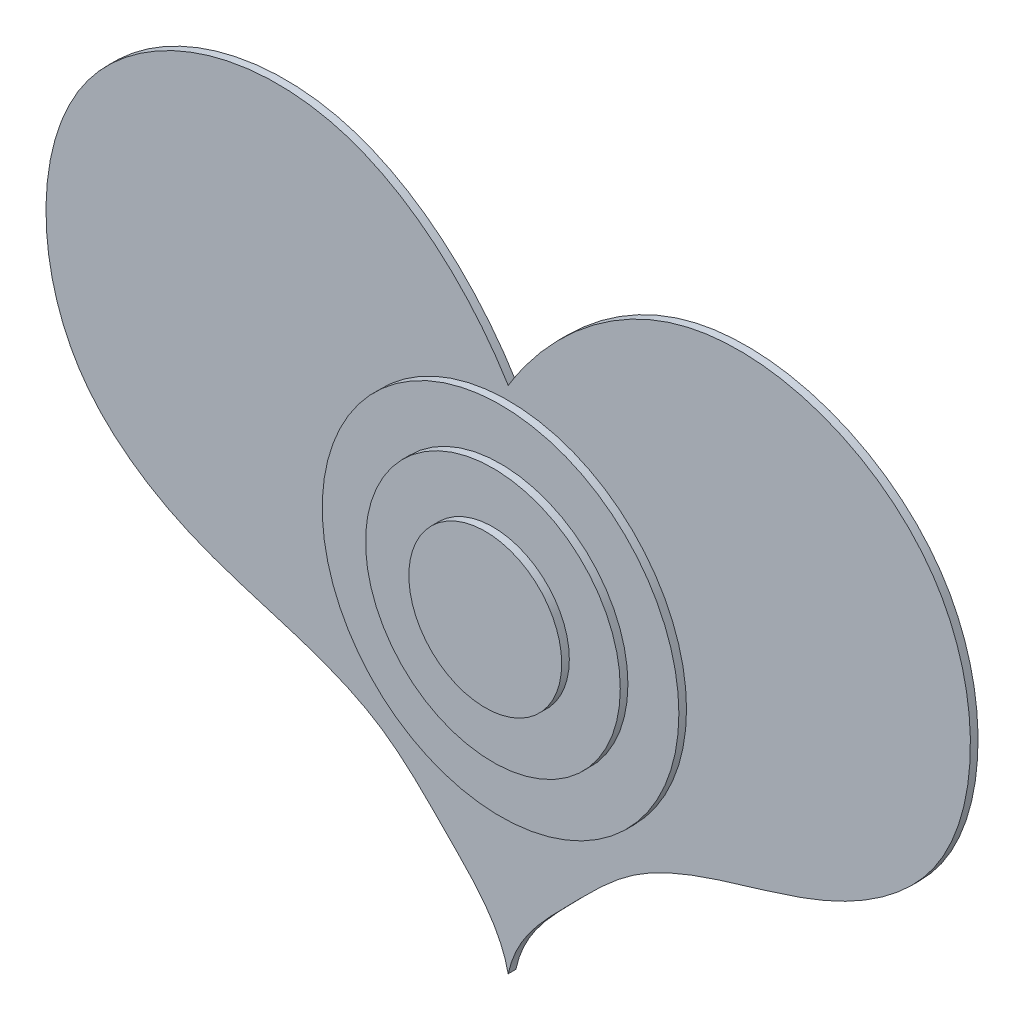
ISO-10303-21;
HEADER;
FILE_DESCRIPTION(('STEP AP214'),'2;1');
FILE_NAME('part.step','',(''),(''),'','','');
FILE_SCHEMA(('AUTOMOTIVE_DESIGN { 1 0 10303 214 1 1 1 1 }'));
ENDSEC;
DATA;
#1=APPLICATION_CONTEXT('core data for automotive mechanical design processes');
#2=APPLICATION_PROTOCOL_DEFINITION('international standard','automotive_design',2000,#1);
#3=PRODUCT_CONTEXT('',#1,'mechanical');
#4=PRODUCT('Part','Part','',(#3));
#5=PRODUCT_RELATED_PRODUCT_CATEGORY('part','',(#4));
#6=PRODUCT_DEFINITION_FORMATION('','',#4);
#7=PRODUCT_DEFINITION_CONTEXT('part definition',#1,'design');
#8=PRODUCT_DEFINITION('design','',#6,#7);
#9=PRODUCT_DEFINITION_SHAPE('','',#8);
#10=(LENGTH_UNIT() NAMED_UNIT(*) SI_UNIT(.MILLI.,.METRE.));
#11=(NAMED_UNIT(*) PLANE_ANGLE_UNIT() SI_UNIT($,.RADIAN.));
#12=(NAMED_UNIT(*) SI_UNIT($,.STERADIAN.) SOLID_ANGLE_UNIT());
#13=UNCERTAINTY_MEASURE_WITH_UNIT(LENGTH_MEASURE(1.E-05),#10,'distance_accuracy_value','');
#14=(GEOMETRIC_REPRESENTATION_CONTEXT(3) GLOBAL_UNCERTAINTY_ASSIGNED_CONTEXT((#13)) GLOBAL_UNIT_ASSIGNED_CONTEXT((#10,
#11,#12)) REPRESENTATION_CONTEXT('',''));
#15=CARTESIAN_POINT('',(0.,0.,0.));
#16=DIRECTION('',(0.,0.,1.));
#17=DIRECTION('',(1.,0.,0.));
#18=AXIS2_PLACEMENT_3D('',#15,#16,#17);
#19=CARTESIAN_POINT('',(0.,-105.813973502007,-3.));
#20=CARTESIAN_POINT('',(3.14138374352489,-91.1313982023127,-3.));
#21=CARTESIAN_POINT('',(21.9291711115177,-72.8831212609514,-3.));
#22=CARTESIAN_POINT('',(49.1347083795301,-44.2055416632962,-3.));
#23=CARTESIAN_POINT('',(86.9143629993046,-30.5957393724164,-3.));
#24=CARTESIAN_POINT('',(129.602182184017,-19.4679291518619,-3.));
#25=CARTESIAN_POINT('',(171.600514001264,9.5392138725982,-3.));
#26=CARTESIAN_POINT('',(186.12313576719,62.2376003688293,-3.));
#27=CARTESIAN_POINT('',(172.01966834021,117.463223926575,-3.));
#28=CARTESIAN_POINT('',(123.714536571012,151.359453215115,-3.));
#29=CARTESIAN_POINT('',(53.8376291321446,154.385235119023,-3.));
#30=CARTESIAN_POINT('',(14.9371970012457,118.791774845464,-3.));
#31=CARTESIAN_POINT('',(0.,94.1860264979931,-3.));
#32=B_SPLINE_CURVE_WITH_KNOTS('',3,(#19,#20,#21,#22,#23,#24,#25,#26,#27,#28,#29,#30,#31),
.UNSPECIFIED.,.F.,.F.,(4,1,1,1,1,1,1,1,1,1,4),(0.,0.0828178370463484,0.151533803954557,
0.22815870802058,0.311744756834966,0.411865787696182,0.507998966649175,0.612712913073144,
0.72508775508206,0.827311907634126,1.),.UNSPECIFIED.);
#33=DIRECTION('',(0.,0.,1.));
#34=VECTOR('',#33,1.);
#35=SURFACE_OF_LINEAR_EXTRUSION('',#32,#34);
#36=CARTESIAN_POINT('',(0.,-105.813973502007,0.));
#37=CARTESIAN_POINT('',(3.14138374352489,-91.1313982023127,0.));
#38=CARTESIAN_POINT('',(21.9291711115177,-72.8831212609514,0.));
#39=CARTESIAN_POINT('',(49.1347083795301,-44.2055416632962,0.));
#40=CARTESIAN_POINT('',(86.9143629993046,-30.5957393724164,0.));
#41=CARTESIAN_POINT('',(129.602182184017,-19.4679291518619,0.));
#42=CARTESIAN_POINT('',(171.600514001264,9.5392138725982,0.));
#43=CARTESIAN_POINT('',(186.12313576719,62.2376003688293,0.));
#44=CARTESIAN_POINT('',(172.01966834021,117.463223926575,0.));
#45=CARTESIAN_POINT('',(123.714536571012,151.359453215115,0.));
#46=CARTESIAN_POINT('',(53.8376291321446,154.385235119023,0.));
#47=CARTESIAN_POINT('',(14.9371970012457,118.791774845464,0.));
#48=CARTESIAN_POINT('',(0.,94.1860264979931,0.));
#49=B_SPLINE_CURVE_WITH_KNOTS('',3,(#36,#37,#38,#39,#40,#41,#42,#43,#44,#45,#46,#47,#48),
.UNSPECIFIED.,.F.,.F.,(4,1,1,1,1,1,1,1,1,1,4),(0.,0.0828178370463484,0.151533803954557,
0.22815870802058,0.311744756834966,0.411865787696182,0.507998966649175,0.612712913073144,
0.72508775508206,0.827311907634126,1.),.UNSPECIFIED.);
#50=CARTESIAN_POINT('',(0.,-105.813973502007,0.));
#51=VERTEX_POINT('',#50);
#52=CARTESIAN_POINT('',(0.,94.1860264979931,0.));
#53=VERTEX_POINT('',#52);
#54=EDGE_CURVE('E71',#51,#53,#49,.T.);
#55=ORIENTED_EDGE('',*,*,#54,.F.);
#56=DIRECTION('',(0.,0.,1.));
#57=VECTOR('',#56,1.);
#58=CARTESIAN_POINT('',(0.,-105.813973502007,-3.));
#59=LINE('',#58,#57);
#60=CARTESIAN_POINT('',(0.,-105.813973502007,-3.));
#61=VERTEX_POINT('',#60);
#62=EDGE_CURVE('E55',#61,#51,#59,.T.);
#63=ORIENTED_EDGE('',*,*,#62,.F.);
#64=CARTESIAN_POINT('',(0.,94.1860264979931,-3.));
#65=VERTEX_POINT('',#64);
#66=EDGE_CURVE('E76',#61,#65,#32,.T.);
#67=ORIENTED_EDGE('',*,*,#66,.T.);
#68=DIRECTION('',(0.,0.,1.));
#69=VECTOR('',#68,1.);
#70=CARTESIAN_POINT('',(0.,94.1860264979931,-3.));
#71=LINE('',#70,#69);
#72=EDGE_CURVE('E40',#65,#53,#71,.T.);
#73=ORIENTED_EDGE('',*,*,#72,.T.);
#74=EDGE_LOOP('',(#55,#63,#67,#73));
#75=FACE_BOUND('',#74,.T.);
#76=ADVANCED_FACE('F36',(#75),#35,.T.);
#77=CARTESIAN_POINT('',(0.,94.1860264979931,-3.));
#78=CARTESIAN_POINT('',(-14.9371970012457,118.791774845464,-3.));
#79=CARTESIAN_POINT('',(-53.8376291321446,154.385235119023,-3.));
#80=CARTESIAN_POINT('',(-123.714536571012,151.359453215115,-3.));
#81=CARTESIAN_POINT('',(-172.01966834021,117.463223926575,-3.));
#82=CARTESIAN_POINT('',(-186.123135767189,62.2376003688293,-3.));
#83=CARTESIAN_POINT('',(-171.600514001264,9.53921387259815,-3.));
#84=CARTESIAN_POINT('',(-129.602182184017,-19.467929151862,-3.));
#85=CARTESIAN_POINT('',(-86.9143629993045,-30.5957393724164,-3.));
#86=CARTESIAN_POINT('',(-49.1347083795301,-44.2055416632962,-3.));
#87=CARTESIAN_POINT('',(-21.9291711115176,-72.8831212609515,-3.));
#88=CARTESIAN_POINT('',(-3.14138374352487,-91.1313982023127,-3.));
#89=CARTESIAN_POINT('',(0.,-105.813973502007,-3.));
#90=B_SPLINE_CURVE_WITH_KNOTS('',3,(#77,#78,#79,#80,#81,#82,#83,#84,#85,#86,#87,#88,#89),
.UNSPECIFIED.,.F.,.F.,(4,1,1,1,1,1,1,1,1,1,4),(0.,0.172688092365874,0.27491224491794,
0.387287086926856,0.492001033350825,0.588134212303818,0.688255243165034,0.77184129197942,
0.848466196045443,0.917182162953652,1.),.UNSPECIFIED.);
#91=DIRECTION('',(0.,0.,1.));
#92=VECTOR('',#91,1.);
#93=SURFACE_OF_LINEAR_EXTRUSION('',#90,#92);
#94=CARTESIAN_POINT('',(0.,94.1860264979931,0.));
#95=CARTESIAN_POINT('',(-14.9371970012457,118.791774845464,0.));
#96=CARTESIAN_POINT('',(-53.8376291321446,154.385235119023,0.));
#97=CARTESIAN_POINT('',(-123.714536571012,151.359453215115,0.));
#98=CARTESIAN_POINT('',(-172.01966834021,117.463223926575,0.));
#99=CARTESIAN_POINT('',(-186.123135767189,62.2376003688293,0.));
#100=CARTESIAN_POINT('',(-171.600514001264,9.53921387259815,0.));
#101=CARTESIAN_POINT('',(-129.602182184017,-19.467929151862,0.));
#102=CARTESIAN_POINT('',(-86.9143629993045,-30.5957393724164,0.));
#103=CARTESIAN_POINT('',(-49.1347083795301,-44.2055416632962,0.));
#104=CARTESIAN_POINT('',(-21.9291711115176,-72.8831212609515,0.));
#105=CARTESIAN_POINT('',(-3.14138374352487,-91.1313982023127,0.));
#106=CARTESIAN_POINT('',(0.,-105.813973502007,0.));
#107=B_SPLINE_CURVE_WITH_KNOTS('',3,(#94,#95,#96,#97,#98,#99,#100,#101,#102,#103,#104,#105,
#106),.UNSPECIFIED.,.F.,.F.,(4,1,1,1,1,1,1,1,1,1,4),(0.,0.172688092365874,0.27491224491794,
0.387287086926856,0.492001033350825,0.588134212303818,0.688255243165034,0.77184129197942,
0.848466196045443,0.917182162953652,1.),.UNSPECIFIED.);
#108=EDGE_CURVE('E67',#53,#51,#107,.T.);
#109=ORIENTED_EDGE('',*,*,#108,.F.);
#110=ORIENTED_EDGE('',*,*,#72,.F.);
#111=EDGE_CURVE('E69',#65,#61,#90,.T.);
#112=ORIENTED_EDGE('',*,*,#111,.T.);
#113=ORIENTED_EDGE('',*,*,#62,.T.);
#114=EDGE_LOOP('',(#109,#110,#112,#113));
#115=FACE_BOUND('',#114,.T.);
#116=ADVANCED_FACE('F65',(#115),#93,.T.);
#117=CARTESIAN_POINT('',(181.241026456675,56.5785133089606,-3.));
#118=DIRECTION('',(0.,0.,1.));
#119=DIRECTION('',(1.,0.,0.));
#120=AXIS2_PLACEMENT_3D('',#117,#118,#119);
#121=PLANE('',#120);
#122=ORIENTED_EDGE('',*,*,#66,.F.);
#123=ORIENTED_EDGE('',*,*,#111,.F.);
#124=EDGE_LOOP('',(#122,#123));
#125=FACE_BOUND('',#124,.T.);
#126=ADVANCED_FACE('F101',(#125),#121,.F.);
#127=CARTESIAN_POINT('',(181.241026456675,56.5785133089606,0.));
#128=DIRECTION('',(0.,0.,1.));
#129=DIRECTION('',(1.,0.,0.));
#130=AXIS2_PLACEMENT_3D('',#127,#128,#129);
#131=PLANE('',#130);
#132=CARTESIAN_POINT('',(0.,19.1113090618028,0.));
#133=DIRECTION('',(0.,0.,1.));
#134=DIRECTION('',(1.,0.,0.));
#135=AXIS2_PLACEMENT_3D('',#132,#133,#134);
#136=CIRCLE('',#135,70.);
#137=CARTESIAN_POINT('',(70.,19.1113090618028,0.));
#138=VERTEX_POINT('',#137);
#139=EDGE_CURVE('E70',#138,#138,#136,.T.);
#140=ORIENTED_EDGE('',*,*,#139,.F.);
#141=EDGE_LOOP('',(#140));
#142=FACE_BOUND('',#141,.T.);
#143=ORIENTED_EDGE('',*,*,#54,.T.);
#144=ORIENTED_EDGE('',*,*,#108,.T.);
#145=EDGE_LOOP('',(#143,#144));
#146=FACE_BOUND('',#145,.T.);
#147=ADVANCED_FACE('F75',(#142,#146),#131,.T.);
#148=CARTESIAN_POINT('',(0.,19.1113090618028,3.));
#149=DIRECTION('',(0.,0.,-1.));
#150=DIRECTION('',(-1.,0.,0.));
#151=AXIS2_PLACEMENT_3D('',#148,#149,#150);
#152=CYLINDRICAL_SURFACE('',#151,70.);
#153=CARTESIAN_POINT('',(0.,19.1113090618028,3.));
#154=DIRECTION('',(0.,0.,1.));
#155=DIRECTION('',(1.,0.,0.));
#156=AXIS2_PLACEMENT_3D('',#153,#154,#155);
#157=CIRCLE('',#156,70.);
#158=CARTESIAN_POINT('',(70.,19.1113090618028,3.));
#159=VERTEX_POINT('',#158);
#160=EDGE_CURVE('E73',#159,#159,#157,.T.);
#161=ORIENTED_EDGE('',*,*,#160,.F.);
#162=EDGE_LOOP('',(#161));
#163=FACE_BOUND('',#162,.T.);
#164=ORIENTED_EDGE('',*,*,#139,.T.);
#165=EDGE_LOOP('',(#164));
#166=FACE_BOUND('',#165,.T.);
#167=ADVANCED_FACE('F104',(#163,#166),#152,.T.);
#168=CARTESIAN_POINT('',(0.,19.1113090618028,3.));
#169=DIRECTION('',(0.,0.,1.));
#170=DIRECTION('',(1.,0.,0.));
#171=AXIS2_PLACEMENT_3D('',#168,#169,#170);
#172=PLANE('',#171);
#173=CARTESIAN_POINT('',(0.,19.1113090618028,3.));
#174=DIRECTION('',(0.,0.,1.));
#175=DIRECTION('',(1.,0.,0.));
#176=AXIS2_PLACEMENT_3D('',#173,#174,#175);
#177=CIRCLE('',#176,50.);
#178=CARTESIAN_POINT('',(50.,19.1113090618028,3.));
#179=VERTEX_POINT('',#178);
#180=EDGE_CURVE('E46',#179,#179,#177,.T.);
#181=ORIENTED_EDGE('',*,*,#180,.F.);
#182=EDGE_LOOP('',(#181));
#183=FACE_BOUND('',#182,.T.);
#184=ORIENTED_EDGE('',*,*,#160,.T.);
#185=EDGE_LOOP('',(#184));
#186=FACE_BOUND('',#185,.T.);
#187=ADVANCED_FACE('F111',(#183,#186),#172,.T.);
#188=CARTESIAN_POINT('',(0.,19.1113090618028,6.));
#189=DIRECTION('',(0.,0.,-1.));
#190=DIRECTION('',(-1.,0.,0.));
#191=AXIS2_PLACEMENT_3D('',#188,#189,#190);
#192=CYLINDRICAL_SURFACE('',#191,50.);
#193=CARTESIAN_POINT('',(0.,19.1113090618028,6.));
#194=DIRECTION('',(0.,0.,1.));
#195=DIRECTION('',(1.,0.,0.));
#196=AXIS2_PLACEMENT_3D('',#193,#194,#195);
#197=CIRCLE('',#196,50.);
#198=CARTESIAN_POINT('',(50.,19.1113090618028,6.));
#199=VERTEX_POINT('',#198);
#200=EDGE_CURVE('E211',#199,#199,#197,.T.);
#201=ORIENTED_EDGE('',*,*,#200,.F.);
#202=EDGE_LOOP('',(#201));
#203=FACE_BOUND('',#202,.T.);
#204=ORIENTED_EDGE('',*,*,#180,.T.);
#205=EDGE_LOOP('',(#204));
#206=FACE_BOUND('',#205,.T.);
#207=ADVANCED_FACE('F115',(#203,#206),#192,.T.);
#208=CARTESIAN_POINT('',(0.,19.1113090618028,6.));
#209=DIRECTION('',(0.,0.,1.));
#210=DIRECTION('',(1.,0.,0.));
#211=AXIS2_PLACEMENT_3D('',#208,#209,#210);
#212=PLANE('',#211);
#213=CARTESIAN_POINT('',(0.,19.1113090618028,6.));
#214=DIRECTION('',(0.,0.,1.));
#215=DIRECTION('',(1.,0.,0.));
#216=AXIS2_PLACEMENT_3D('',#213,#214,#215);
#217=CIRCLE('',#216,30.);
#218=CARTESIAN_POINT('',(30.,19.1113090618028,6.));
#219=VERTEX_POINT('',#218);
#220=EDGE_CURVE('E11',#219,#219,#217,.T.);
#221=ORIENTED_EDGE('',*,*,#220,.F.);
#222=EDGE_LOOP('',(#221));
#223=FACE_BOUND('',#222,.T.);
#224=ORIENTED_EDGE('',*,*,#200,.T.);
#225=EDGE_LOOP('',(#224));
#226=FACE_BOUND('',#225,.T.);
#227=ADVANCED_FACE('F119',(#223,#226),#212,.T.);
#228=CARTESIAN_POINT('',(0.,19.1113090618028,9.));
#229=DIRECTION('',(0.,0.,-1.));
#230=DIRECTION('',(-1.,0.,0.));
#231=AXIS2_PLACEMENT_3D('',#228,#229,#230);
#232=CYLINDRICAL_SURFACE('',#231,30.);
#233=CARTESIAN_POINT('',(0.,19.1113090618028,9.));
#234=DIRECTION('',(0.,0.,1.));
#235=DIRECTION('',(1.,0.,0.));
#236=AXIS2_PLACEMENT_3D('',#233,#234,#235);
#237=CIRCLE('',#236,30.);
#238=CARTESIAN_POINT('',(30.,19.1113090618028,9.));
#239=VERTEX_POINT('',#238);
#240=EDGE_CURVE('E210',#239,#239,#237,.T.);
#241=ORIENTED_EDGE('',*,*,#240,.F.);
#242=EDGE_LOOP('',(#241));
#243=FACE_BOUND('',#242,.T.);
#244=ORIENTED_EDGE('',*,*,#220,.T.);
#245=EDGE_LOOP('',(#244));
#246=FACE_BOUND('',#245,.T.);
#247=ADVANCED_FACE('F123',(#243,#246),#232,.T.);
#248=CARTESIAN_POINT('',(0.,19.1113090618028,9.));
#249=DIRECTION('',(0.,0.,1.));
#250=DIRECTION('',(1.,0.,0.));
#251=AXIS2_PLACEMENT_3D('',#248,#249,#250);
#252=PLANE('',#251);
#253=ORIENTED_EDGE('',*,*,#240,.T.);
#254=EDGE_LOOP('',(#253));
#255=FACE_BOUND('',#254,.T.);
#256=ADVANCED_FACE('F127',(#255),#252,.T.);
#257=CLOSED_SHELL('',(#76,#116,#126,#147,#167,#187,#207,#227,#247,#256));
#258=MANIFOLD_SOLID_BREP('B2',#257);
#259=ADVANCED_BREP_SHAPE_REPRESENTATION('',(#18,#258),#14);
#260=SHAPE_DEFINITION_REPRESENTATION(#9,#259);
ENDSEC;
END-ISO-10303-21;
